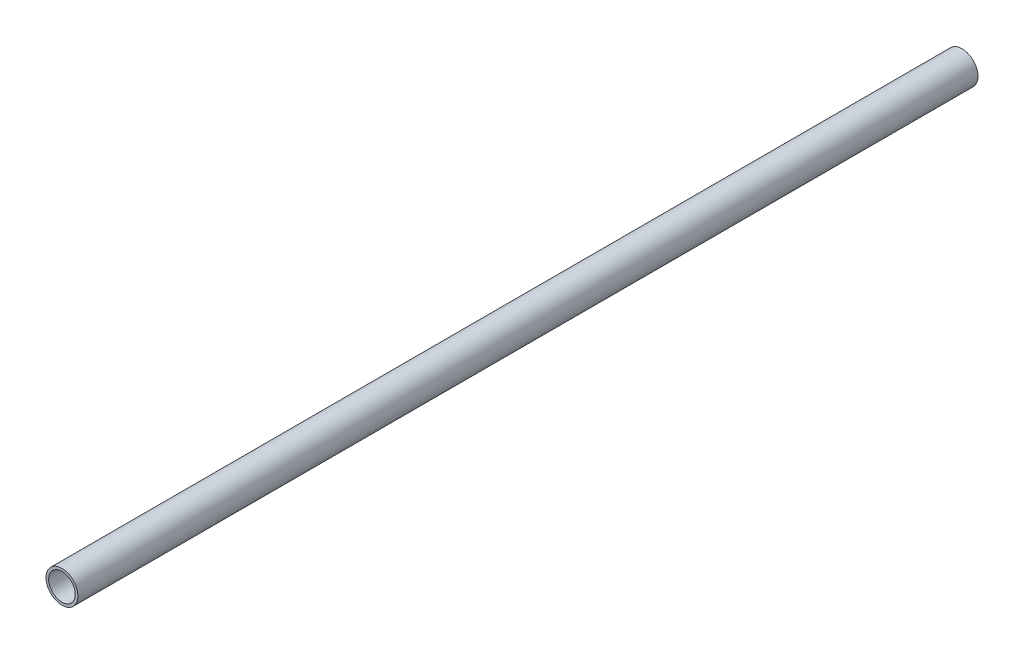
ISO-10303-21;
HEADER;
FILE_DESCRIPTION(('STEP AP214'),'2;1');
FILE_NAME('part.step','',(''),(''),'','','');
FILE_SCHEMA(('AUTOMOTIVE_DESIGN { 1 0 10303 214 1 1 1 1 }'));
ENDSEC;
DATA;
#1=APPLICATION_CONTEXT('core data for automotive mechanical design processes');
#2=APPLICATION_PROTOCOL_DEFINITION('international standard','automotive_design',2000,#1);
#3=PRODUCT_CONTEXT('',#1,'mechanical');
#4=PRODUCT('Part','Part','',(#3));
#5=PRODUCT_RELATED_PRODUCT_CATEGORY('part','',(#4));
#6=PRODUCT_DEFINITION_FORMATION('','',#4);
#7=PRODUCT_DEFINITION_CONTEXT('part definition',#1,'design');
#8=PRODUCT_DEFINITION('design','',#6,#7);
#9=PRODUCT_DEFINITION_SHAPE('','',#8);
#10=(LENGTH_UNIT() NAMED_UNIT(*) SI_UNIT(.MILLI.,.METRE.));
#11=(NAMED_UNIT(*) PLANE_ANGLE_UNIT() SI_UNIT($,.RADIAN.));
#12=(NAMED_UNIT(*) SI_UNIT($,.STERADIAN.) SOLID_ANGLE_UNIT());
#13=UNCERTAINTY_MEASURE_WITH_UNIT(LENGTH_MEASURE(1.E-05),#10,'distance_accuracy_value','');
#14=(GEOMETRIC_REPRESENTATION_CONTEXT(3) GLOBAL_UNCERTAINTY_ASSIGNED_CONTEXT((#13)) GLOBAL_UNIT_ASSIGNED_CONTEXT((#10,
#11,#12)) REPRESENTATION_CONTEXT('',''));
#15=CARTESIAN_POINT('',(0.,0.,0.));
#16=DIRECTION('',(0.,0.,1.));
#17=DIRECTION('',(1.,0.,0.));
#18=AXIS2_PLACEMENT_3D('',#15,#16,#17);
#19=CARTESIAN_POINT('',(0.,0.,338.));
#20=DIRECTION('',(0.,0.,1.));
#21=DIRECTION('',(1.,0.,0.));
#22=AXIS2_PLACEMENT_3D('',#19,#20,#21);
#23=PLANE('',#22);
#24=CARTESIAN_POINT('',(0.,0.,338.));
#25=DIRECTION('',(0.,0.,1.));
#26=DIRECTION('',(1.,0.,0.));
#27=AXIS2_PLACEMENT_3D('',#24,#25,#26);
#28=CIRCLE('',#27,6.);
#29=CARTESIAN_POINT('',(6.,0.,338.));
#30=VERTEX_POINT('',#29);
#31=EDGE_CURVE('E10',#30,#30,#28,.T.);
#32=ORIENTED_EDGE('',*,*,#31,.T.);
#33=EDGE_LOOP('',(#32));
#34=FACE_BOUND('',#33,.T.);
#35=CARTESIAN_POINT('',(0.,0.,338.));
#36=DIRECTION('',(0.,0.,1.));
#37=DIRECTION('',(1.,0.,0.));
#38=AXIS2_PLACEMENT_3D('',#35,#36,#37);
#39=CIRCLE('',#38,5.);
#40=CARTESIAN_POINT('',(5.,0.,338.));
#41=VERTEX_POINT('',#40);
#42=EDGE_CURVE('E52',#41,#41,#39,.T.);
#43=ORIENTED_EDGE('',*,*,#42,.F.);
#44=EDGE_LOOP('',(#43));
#45=FACE_BOUND('',#44,.T.);
#46=ADVANCED_FACE('F41',(#34,#45),#23,.T.);
#47=CARTESIAN_POINT('',(0.,0.,0.));
#48=DIRECTION('',(0.,0.,1.));
#49=DIRECTION('',(1.,0.,0.));
#50=AXIS2_PLACEMENT_3D('',#47,#48,#49);
#51=PLANE('',#50);
#52=CARTESIAN_POINT('',(0.,0.,0.));
#53=DIRECTION('',(0.,0.,1.));
#54=DIRECTION('',(1.,0.,0.));
#55=AXIS2_PLACEMENT_3D('',#52,#53,#54);
#56=CIRCLE('',#55,6.);
#57=CARTESIAN_POINT('',(6.,0.,0.));
#58=VERTEX_POINT('',#57);
#59=EDGE_CURVE('E45',#58,#58,#56,.T.);
#60=ORIENTED_EDGE('',*,*,#59,.F.);
#61=EDGE_LOOP('',(#60));
#62=FACE_BOUND('',#61,.T.);
#63=CARTESIAN_POINT('',(0.,0.,0.));
#64=DIRECTION('',(0.,0.,1.));
#65=DIRECTION('',(1.,0.,0.));
#66=AXIS2_PLACEMENT_3D('',#63,#64,#65);
#67=CIRCLE('',#66,5.);
#68=CARTESIAN_POINT('',(5.,0.,0.));
#69=VERTEX_POINT('',#68);
#70=EDGE_CURVE('E54',#69,#69,#67,.T.);
#71=ORIENTED_EDGE('',*,*,#70,.T.);
#72=EDGE_LOOP('',(#71));
#73=FACE_BOUND('',#72,.T.);
#74=ADVANCED_FACE('F64',(#62,#73),#51,.F.);
#75=CARTESIAN_POINT('',(0.,0.,338.));
#76=DIRECTION('',(0.,0.,-1.));
#77=DIRECTION('',(-1.,0.,0.));
#78=AXIS2_PLACEMENT_3D('',#75,#76,#77);
#79=CYLINDRICAL_SURFACE('',#78,6.);
#80=ORIENTED_EDGE('',*,*,#31,.F.);
#81=EDGE_LOOP('',(#80));
#82=FACE_BOUND('',#81,.T.);
#83=ORIENTED_EDGE('',*,*,#59,.T.);
#84=EDGE_LOOP('',(#83));
#85=FACE_BOUND('',#84,.T.);
#86=ADVANCED_FACE('F43',(#82,#85),#79,.T.);
#87=CARTESIAN_POINT('',(0.,0.,338.));
#88=DIRECTION('',(0.,0.,-1.));
#89=DIRECTION('',(-1.,0.,0.));
#90=AXIS2_PLACEMENT_3D('',#87,#88,#89);
#91=CYLINDRICAL_SURFACE('',#90,5.);
#92=ORIENTED_EDGE('',*,*,#42,.T.);
#93=EDGE_LOOP('',(#92));
#94=FACE_BOUND('',#93,.T.);
#95=ORIENTED_EDGE('',*,*,#70,.F.);
#96=EDGE_LOOP('',(#95));
#97=FACE_BOUND('',#96,.T.);
#98=ADVANCED_FACE('F60',(#94,#97),#91,.F.);
#99=CLOSED_SHELL('',(#46,#74,#86,#98));
#100=MANIFOLD_SOLID_BREP('B2',#99);
#101=ADVANCED_BREP_SHAPE_REPRESENTATION('',(#18,#100),#14);
#102=SHAPE_DEFINITION_REPRESENTATION(#9,#101);
ENDSEC;
END-ISO-10303-21;
